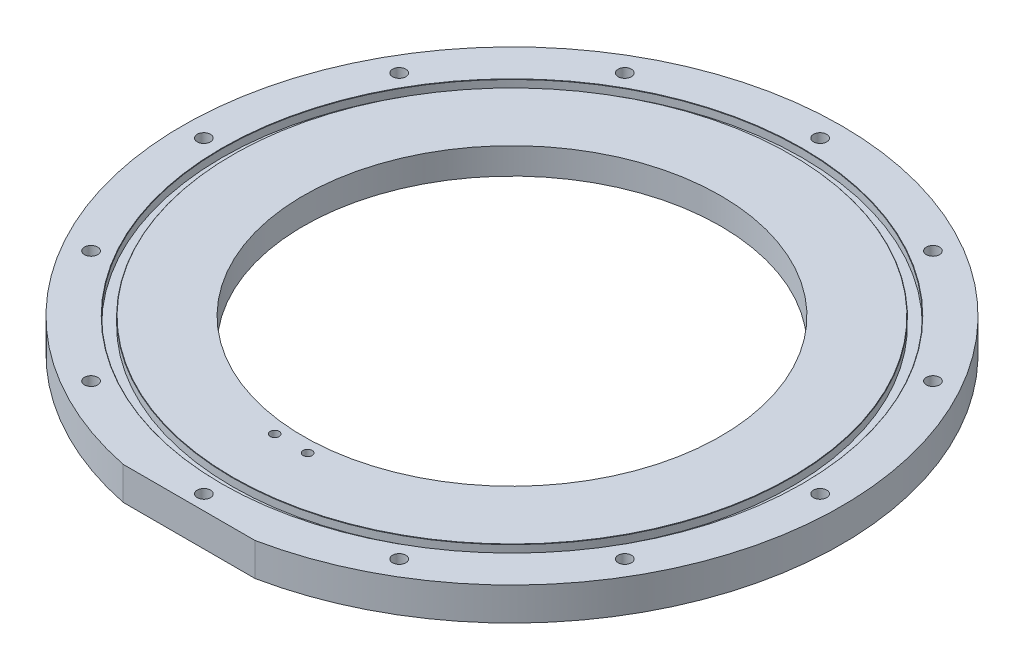
ISO-10303-21;
HEADER;
FILE_DESCRIPTION(('STEP AP214'),'2;1');
FILE_NAME('part.step','',(''),(''),'','','');
FILE_SCHEMA(('AUTOMOTIVE_DESIGN { 1 0 10303 214 1 1 1 1 }'));
ENDSEC;
DATA;
#1=APPLICATION_CONTEXT('core data for automotive mechanical design processes');
#2=APPLICATION_PROTOCOL_DEFINITION('international standard','automotive_design',2000,#1);
#3=PRODUCT_CONTEXT('',#1,'mechanical');
#4=PRODUCT('Part','Part','',(#3));
#5=PRODUCT_RELATED_PRODUCT_CATEGORY('part','',(#4));
#6=PRODUCT_DEFINITION_FORMATION('','',#4);
#7=PRODUCT_DEFINITION_CONTEXT('part definition',#1,'design');
#8=PRODUCT_DEFINITION('design','',#6,#7);
#9=PRODUCT_DEFINITION_SHAPE('','',#8);
#10=(LENGTH_UNIT() NAMED_UNIT(*) SI_UNIT(.MILLI.,.METRE.));
#11=(NAMED_UNIT(*) PLANE_ANGLE_UNIT() SI_UNIT($,.RADIAN.));
#12=(NAMED_UNIT(*) SI_UNIT($,.STERADIAN.) SOLID_ANGLE_UNIT());
#13=UNCERTAINTY_MEASURE_WITH_UNIT(LENGTH_MEASURE(1.E-05),#10,'distance_accuracy_value','');
#14=(GEOMETRIC_REPRESENTATION_CONTEXT(3) GLOBAL_UNCERTAINTY_ASSIGNED_CONTEXT((#13)) GLOBAL_UNIT_ASSIGNED_CONTEXT((#10,
#11,#12)) REPRESENTATION_CONTEXT('',''));
#15=CARTESIAN_POINT('',(0.,0.,0.));
#16=DIRECTION('',(0.,0.,1.));
#17=DIRECTION('',(1.,0.,0.));
#18=AXIS2_PLACEMENT_3D('',#15,#16,#17);
#19=CARTESIAN_POINT('',(105.7783,12.7,0.));
#20=DIRECTION('',(0.,1.,0.));
#21=DIRECTION('',(0.,0.,1.));
#22=AXIS2_PLACEMENT_3D('',#19,#20,#21);
#23=PLANE('',#22);
#24=CARTESIAN_POINT('',(-6.35,12.7,85.09));
#25=DIRECTION('',(0.,1.,0.));
#26=DIRECTION('',(0.,0.,1.));
#27=AXIS2_PLACEMENT_3D('',#24,#25,#26);
#28=CIRCLE('',#27,1.7272);
#29=CARTESIAN_POINT('',(-6.35,12.7,86.8172));
#30=VERTEX_POINT('',#29);
#31=EDGE_CURVE('E499',#30,#30,#28,.T.);
#32=ORIENTED_EDGE('',*,*,#31,.F.);
#33=EDGE_LOOP('',(#32));
#34=FACE_BOUND('',#33,.T.);
#35=CARTESIAN_POINT('',(6.35,12.7,85.09));
#36=DIRECTION('',(0.,1.,0.));
#37=DIRECTION('',(0.,0.,1.));
#38=AXIS2_PLACEMENT_3D('',#35,#36,#37);
#39=CIRCLE('',#38,1.7272);
#40=CARTESIAN_POINT('',(6.35,12.7,86.8172));
#41=VERTEX_POINT('',#40);
#42=EDGE_CURVE('E493',#41,#41,#39,.T.);
#43=ORIENTED_EDGE('',*,*,#42,.F.);
#44=EDGE_LOOP('',(#43));
#45=FACE_BOUND('',#44,.T.);
#46=CARTESIAN_POINT('',(0.,12.7,0.));
#47=DIRECTION('',(0.,1.,0.));
#48=DIRECTION('',(0.,0.,1.));
#49=AXIS2_PLACEMENT_3D('',#46,#47,#48);
#50=CIRCLE('',#49,107.6198);
#51=CARTESIAN_POINT('',(0.,12.7,107.6198));
#52=VERTEX_POINT('',#51);
#53=EDGE_CURVE('E86',#52,#52,#50,.T.);
#54=ORIENTED_EDGE('',*,*,#53,.T.);
#55=EDGE_LOOP('',(#54));
#56=FACE_BOUND('',#55,.T.);
#57=CARTESIAN_POINT('',(0.,12.7,0.));
#58=DIRECTION('',(0.,-1.,0.));
#59=DIRECTION('',(0.,0.,-1.));
#60=AXIS2_PLACEMENT_3D('',#57,#58,#59);
#61=CIRCLE('',#60,80.3783);
#62=CARTESIAN_POINT('',(0.,12.7,-80.3783));
#63=VERTEX_POINT('',#62);
#64=EDGE_CURVE('E84',#63,#63,#61,.T.);
#65=ORIENTED_EDGE('',*,*,#64,.T.);
#66=EDGE_LOOP('',(#65));
#67=FACE_BOUND('',#66,.T.);
#68=ADVANCED_FACE('F41',(#34,#45,#56,#67),#23,.T.);
#69=CARTESIAN_POINT('',(109.7915,0.,0.));
#70=DIRECTION('',(0.,-1.,0.));
#71=DIRECTION('',(0.,0.,-1.));
#72=AXIS2_PLACEMENT_3D('',#69,#70,#71);
#73=PLANE('',#72);
#74=DIRECTION('',(-1.,0.,0.));
#75=VECTOR('',#74,1.);
#76=CARTESIAN_POINT('',(-25.4,0.,124.434078933385));
#77=LINE('',#76,#75);
#78=CARTESIAN_POINT('',(25.4,0.,124.434078933385));
#79=VERTEX_POINT('',#78);
#80=CARTESIAN_POINT('',(-25.4,0.,124.434078933385));
#81=VERTEX_POINT('',#80);
#82=EDGE_CURVE('E73',#79,#81,#77,.T.);
#83=ORIENTED_EDGE('',*,*,#82,.T.);
#84=CARTESIAN_POINT('',(0.,0.,0.));
#85=DIRECTION('',(0.,-1.,0.));
#86=DIRECTION('',(0.,0.,-1.));
#87=AXIS2_PLACEMENT_3D('',#84,#85,#86);
#88=CIRCLE('',#87,127.);
#89=EDGE_CURVE('E80',#81,#79,#88,.T.);
#90=ORIENTED_EDGE('',*,*,#89,.T.);
#91=EDGE_LOOP('',(#83,#90));
#92=FACE_BOUND('',#91,.T.);
#93=CARTESIAN_POINT('',(0.,0.,-118.745));
#94=DIRECTION('',(0.,-1.,0.));
#95=DIRECTION('',(0.,0.,-1.));
#96=AXIS2_PLACEMENT_3D('',#93,#94,#95);
#97=CIRCLE('',#96,2.5527);
#98=CARTESIAN_POINT('',(0.,0.,-121.2977));
#99=VERTEX_POINT('',#98);
#100=EDGE_CURVE('E481',#99,#99,#97,.T.);
#101=ORIENTED_EDGE('',*,*,#100,.F.);
#102=EDGE_LOOP('',(#101));
#103=FACE_BOUND('',#102,.T.);
#104=CARTESIAN_POINT('',(59.3725,0.,-102.836186572383));
#105=DIRECTION('',(0.,-1.,0.));
#106=DIRECTION('',(0.,0.,-1.));
#107=AXIS2_PLACEMENT_3D('',#104,#105,#106);
#108=CIRCLE('',#107,2.5527);
#109=CARTESIAN_POINT('',(59.3725,0.,-105.388886572383));
#110=VERTEX_POINT('',#109);
#111=EDGE_CURVE('E475',#110,#110,#108,.T.);
#112=ORIENTED_EDGE('',*,*,#111,.F.);
#113=EDGE_LOOP('',(#112));
#114=FACE_BOUND('',#113,.T.);
#115=CARTESIAN_POINT('',(102.836186572383,0.,-59.3725));
#116=DIRECTION('',(0.,-1.,0.));
#117=DIRECTION('',(0.,0.,-1.));
#118=AXIS2_PLACEMENT_3D('',#115,#116,#117);
#119=CIRCLE('',#118,2.5527);
#120=CARTESIAN_POINT('',(102.836186572383,0.,-61.9252));
#121=VERTEX_POINT('',#120);
#122=EDGE_CURVE('E469',#121,#121,#119,.T.);
#123=ORIENTED_EDGE('',*,*,#122,.F.);
#124=EDGE_LOOP('',(#123));
#125=FACE_BOUND('',#124,.T.);
#126=CARTESIAN_POINT('',(118.745,0.,0.));
#127=DIRECTION('',(0.,-1.,0.));
#128=DIRECTION('',(0.,0.,-1.));
#129=AXIS2_PLACEMENT_3D('',#126,#127,#128);
#130=CIRCLE('',#129,2.5527);
#131=CARTESIAN_POINT('',(118.745,0.,-2.55270000000001));
#132=VERTEX_POINT('',#131);
#133=EDGE_CURVE('E463',#132,#132,#130,.T.);
#134=ORIENTED_EDGE('',*,*,#133,.F.);
#135=EDGE_LOOP('',(#134));
#136=FACE_BOUND('',#135,.T.);
#137=CARTESIAN_POINT('',(102.836186572383,0.,59.3725));
#138=DIRECTION('',(0.,-1.,0.));
#139=DIRECTION('',(0.,0.,-1.));
#140=AXIS2_PLACEMENT_3D('',#137,#138,#139);
#141=CIRCLE('',#140,2.5527);
#142=CARTESIAN_POINT('',(102.836186572383,0.,56.8198));
#143=VERTEX_POINT('',#142);
#144=EDGE_CURVE('E457',#143,#143,#141,.T.);
#145=ORIENTED_EDGE('',*,*,#144,.F.);
#146=EDGE_LOOP('',(#145));
#147=FACE_BOUND('',#146,.T.);
#148=CARTESIAN_POINT('',(59.3725,0.,102.836186572383));
#149=DIRECTION('',(0.,-1.,0.));
#150=DIRECTION('',(0.,0.,-1.));
#151=AXIS2_PLACEMENT_3D('',#148,#149,#150);
#152=CIRCLE('',#151,2.5527);
#153=CARTESIAN_POINT('',(59.3725,0.,100.283486572383));
#154=VERTEX_POINT('',#153);
#155=EDGE_CURVE('E451',#154,#154,#152,.T.);
#156=ORIENTED_EDGE('',*,*,#155,.F.);
#157=EDGE_LOOP('',(#156));
#158=FACE_BOUND('',#157,.T.);
#159=CARTESIAN_POINT('',(0.,0.,118.745));
#160=DIRECTION('',(0.,-1.,0.));
#161=DIRECTION('',(0.,0.,-1.));
#162=AXIS2_PLACEMENT_3D('',#159,#160,#161);
#163=CIRCLE('',#162,2.5527);
#164=CARTESIAN_POINT('',(0.,0.,116.1923));
#165=VERTEX_POINT('',#164);
#166=EDGE_CURVE('E445',#165,#165,#163,.T.);
#167=ORIENTED_EDGE('',*,*,#166,.F.);
#168=EDGE_LOOP('',(#167));
#169=FACE_BOUND('',#168,.T.);
#170=CARTESIAN_POINT('',(-59.3725,0.,102.836186572383));
#171=DIRECTION('',(0.,-1.,0.));
#172=DIRECTION('',(0.,0.,-1.));
#173=AXIS2_PLACEMENT_3D('',#170,#171,#172);
#174=CIRCLE('',#173,2.5527);
#175=CARTESIAN_POINT('',(-59.3725,0.,100.283486572383));
#176=VERTEX_POINT('',#175);
#177=EDGE_CURVE('E439',#176,#176,#174,.T.);
#178=ORIENTED_EDGE('',*,*,#177,.F.);
#179=EDGE_LOOP('',(#178));
#180=FACE_BOUND('',#179,.T.);
#181=CARTESIAN_POINT('',(-102.836186572383,0.,59.3725));
#182=DIRECTION('',(0.,-1.,0.));
#183=DIRECTION('',(0.,0.,-1.));
#184=AXIS2_PLACEMENT_3D('',#181,#182,#183);
#185=CIRCLE('',#184,2.5527);
#186=CARTESIAN_POINT('',(-102.836186572383,0.,56.8198));
#187=VERTEX_POINT('',#186);
#188=EDGE_CURVE('E433',#187,#187,#185,.T.);
#189=ORIENTED_EDGE('',*,*,#188,.F.);
#190=EDGE_LOOP('',(#189));
#191=FACE_BOUND('',#190,.T.);
#192=CARTESIAN_POINT('',(-118.745,0.,0.));
#193=DIRECTION('',(0.,-1.,0.));
#194=DIRECTION('',(0.,0.,-1.));
#195=AXIS2_PLACEMENT_3D('',#192,#193,#194);
#196=CIRCLE('',#195,2.5527);
#197=CARTESIAN_POINT('',(-118.745,0.,-2.55269999999998));
#198=VERTEX_POINT('',#197);
#199=EDGE_CURVE('E427',#198,#198,#196,.T.);
#200=ORIENTED_EDGE('',*,*,#199,.F.);
#201=EDGE_LOOP('',(#200));
#202=FACE_BOUND('',#201,.T.);
#203=CARTESIAN_POINT('',(-102.836186572383,0.,-59.3724999999999));
#204=DIRECTION('',(0.,-1.,0.));
#205=DIRECTION('',(0.,0.,-1.));
#206=AXIS2_PLACEMENT_3D('',#203,#204,#205);
#207=CIRCLE('',#206,2.5527);
#208=CARTESIAN_POINT('',(-102.836186572383,0.,-61.9251999999999));
#209=VERTEX_POINT('',#208);
#210=EDGE_CURVE('E421',#209,#209,#207,.T.);
#211=ORIENTED_EDGE('',*,*,#210,.F.);
#212=EDGE_LOOP('',(#211));
#213=FACE_BOUND('',#212,.T.);
#214=CARTESIAN_POINT('',(-59.3725,0.,-102.836186572383));
#215=DIRECTION('',(0.,-1.,0.));
#216=DIRECTION('',(0.,0.,-1.));
#217=AXIS2_PLACEMENT_3D('',#214,#215,#216);
#218=CIRCLE('',#217,2.5527);
#219=CARTESIAN_POINT('',(-59.3725,0.,-105.388886572383));
#220=VERTEX_POINT('',#219);
#221=EDGE_CURVE('E413',#220,#220,#218,.T.);
#222=ORIENTED_EDGE('',*,*,#221,.F.);
#223=EDGE_LOOP('',(#222));
#224=FACE_BOUND('',#223,.T.);
#225=CARTESIAN_POINT('',(0.,0.,0.));
#226=DIRECTION('',(0.,-1.,0.));
#227=DIRECTION('',(0.,0.,-1.));
#228=AXIS2_PLACEMENT_3D('',#225,#226,#227);
#229=CIRCLE('',#228,109.7915);
#230=CARTESIAN_POINT('',(0.,0.,-109.7915));
#231=VERTEX_POINT('',#230);
#232=EDGE_CURVE('E406',#231,#231,#229,.T.);
#233=ORIENTED_EDGE('',*,*,#232,.F.);
#234=EDGE_LOOP('',(#233));
#235=FACE_BOUND('',#234,.T.);
#236=ADVANCED_FACE('F117',(#92,#103,#114,#125,#136,#147,#158,#169,#180,#191,#202,#213,#224,
#235),#73,.T.);
#237=CARTESIAN_POINT('',(0.,0.,0.));
#238=DIRECTION('',(0.,-1.,0.));
#239=DIRECTION('',(0.,0.,-1.));
#240=AXIS2_PLACEMENT_3D('',#237,#238,#239);
#241=CYLINDRICAL_SURFACE('',#240,127.);
#242=DIRECTION('',(0.,-1.,0.));
#243=VECTOR('',#242,1.);
#244=CARTESIAN_POINT('',(25.4,0.,124.434078933385));
#245=LINE('',#244,#243);
#246=CARTESIAN_POINT('',(25.4,12.7,124.434078933385));
#247=VERTEX_POINT('',#246);
#248=EDGE_CURVE('E57',#247,#79,#245,.T.);
#249=ORIENTED_EDGE('',*,*,#248,.T.);
#250=ORIENTED_EDGE('',*,*,#89,.F.);
#251=DIRECTION('',(0.,-1.,0.));
#252=VECTOR('',#251,1.);
#253=CARTESIAN_POINT('',(-25.4,0.,124.434078933385));
#254=LINE('',#253,#252);
#255=CARTESIAN_POINT('',(-25.4,12.7,124.434078933385));
#256=VERTEX_POINT('',#255);
#257=EDGE_CURVE('E62',#81,#256,#254,.F.);
#258=ORIENTED_EDGE('',*,*,#257,.T.);
#259=CARTESIAN_POINT('',(0.,12.7,0.));
#260=DIRECTION('',(0.,-1.,0.));
#261=DIRECTION('',(0.,0.,-1.));
#262=AXIS2_PLACEMENT_3D('',#259,#260,#261);
#263=CIRCLE('',#262,127.);
#264=EDGE_CURVE('E78',#256,#247,#263,.T.);
#265=ORIENTED_EDGE('',*,*,#264,.T.);
#266=EDGE_LOOP('',(#249,#250,#258,#265));
#267=FACE_BOUND('',#266,.T.);
#268=ADVANCED_FACE('F77',(#267),#241,.T.);
#269=DIRECTION('',(-1.,0.,0.));
#270=VECTOR('',#269,1.);
#271=CARTESIAN_POINT('',(-25.4,12.7,124.434078933385));
#272=LINE('',#271,#270);
#273=EDGE_CURVE('E67',#247,#256,#272,.T.);
#274=ORIENTED_EDGE('',*,*,#273,.F.);
#275=ORIENTED_EDGE('',*,*,#264,.F.);
#276=EDGE_LOOP('',(#274,#275));
#277=FACE_BOUND('',#276,.T.);
#278=CARTESIAN_POINT('',(0.,12.7,0.));
#279=DIRECTION('',(0.,1.,0.));
#280=DIRECTION('',(0.,0.,1.));
#281=AXIS2_PLACEMENT_3D('',#278,#279,#280);
#282=CIRCLE('',#281,111.9378);
#283=CARTESIAN_POINT('',(0.,12.7,111.9378));
#284=VERTEX_POINT('',#283);
#285=EDGE_CURVE('E11',#284,#284,#282,.F.);
#286=ORIENTED_EDGE('',*,*,#285,.T.);
#287=EDGE_LOOP('',(#286));
#288=FACE_BOUND('',#287,.T.);
#289=CARTESIAN_POINT('',(0.,12.7,-118.745));
#290=DIRECTION('',(0.,1.,0.));
#291=DIRECTION('',(0.,0.,1.));
#292=AXIS2_PLACEMENT_3D('',#289,#290,#291);
#293=CIRCLE('',#292,2.5527);
#294=CARTESIAN_POINT('',(0.,12.7,-116.1923));
#295=VERTEX_POINT('',#294);
#296=EDGE_CURVE('E484',#295,#295,#293,.T.);
#297=ORIENTED_EDGE('',*,*,#296,.F.);
#298=EDGE_LOOP('',(#297));
#299=FACE_BOUND('',#298,.T.);
#300=CARTESIAN_POINT('',(59.3725,12.7,-102.836186572383));
#301=DIRECTION('',(0.,1.,0.));
#302=DIRECTION('',(0.,0.,1.));
#303=AXIS2_PLACEMENT_3D('',#300,#301,#302);
#304=CIRCLE('',#303,2.5527);
#305=CARTESIAN_POINT('',(59.3725,12.7,-100.283486572383));
#306=VERTEX_POINT('',#305);
#307=EDGE_CURVE('E478',#306,#306,#304,.T.);
#308=ORIENTED_EDGE('',*,*,#307,.F.);
#309=EDGE_LOOP('',(#308));
#310=FACE_BOUND('',#309,.T.);
#311=CARTESIAN_POINT('',(102.836186572383,12.7,-59.3725));
#312=DIRECTION('',(0.,1.,0.));
#313=DIRECTION('',(0.,0.,1.));
#314=AXIS2_PLACEMENT_3D('',#311,#312,#313);
#315=CIRCLE('',#314,2.55270000000001);
#316=CARTESIAN_POINT('',(102.836186572383,12.7,-56.8198));
#317=VERTEX_POINT('',#316);
#318=EDGE_CURVE('E472',#317,#317,#315,.T.);
#319=ORIENTED_EDGE('',*,*,#318,.F.);
#320=EDGE_LOOP('',(#319));
#321=FACE_BOUND('',#320,.T.);
#322=CARTESIAN_POINT('',(118.745,12.7,0.));
#323=DIRECTION('',(0.,1.,0.));
#324=DIRECTION('',(0.,0.,1.));
#325=AXIS2_PLACEMENT_3D('',#322,#323,#324);
#326=CIRCLE('',#325,2.55270000000001);
#327=CARTESIAN_POINT('',(118.745,12.7,2.5527));
#328=VERTEX_POINT('',#327);
#329=EDGE_CURVE('E466',#328,#328,#326,.T.);
#330=ORIENTED_EDGE('',*,*,#329,.F.);
#331=EDGE_LOOP('',(#330));
#332=FACE_BOUND('',#331,.T.);
#333=CARTESIAN_POINT('',(102.836186572383,12.7,59.3725));
#334=DIRECTION('',(0.,1.,0.));
#335=DIRECTION('',(0.,0.,1.));
#336=AXIS2_PLACEMENT_3D('',#333,#334,#335);
#337=CIRCLE('',#336,2.55270000000001);
#338=CARTESIAN_POINT('',(102.836186572383,12.7,61.9252));
#339=VERTEX_POINT('',#338);
#340=EDGE_CURVE('E460',#339,#339,#337,.T.);
#341=ORIENTED_EDGE('',*,*,#340,.F.);
#342=EDGE_LOOP('',(#341));
#343=FACE_BOUND('',#342,.T.);
#344=CARTESIAN_POINT('',(59.3725,12.7,102.836186572383));
#345=DIRECTION('',(0.,1.,0.));
#346=DIRECTION('',(0.,0.,1.));
#347=AXIS2_PLACEMENT_3D('',#344,#345,#346);
#348=CIRCLE('',#347,2.5527);
#349=CARTESIAN_POINT('',(59.3725,12.7,105.388886572383));
#350=VERTEX_POINT('',#349);
#351=EDGE_CURVE('E454',#350,#350,#348,.T.);
#352=ORIENTED_EDGE('',*,*,#351,.F.);
#353=EDGE_LOOP('',(#352));
#354=FACE_BOUND('',#353,.T.);
#355=CARTESIAN_POINT('',(0.,12.7,118.745));
#356=DIRECTION('',(0.,1.,0.));
#357=DIRECTION('',(0.,0.,1.));
#358=AXIS2_PLACEMENT_3D('',#355,#356,#357);
#359=CIRCLE('',#358,2.5527);
#360=CARTESIAN_POINT('',(0.,12.7,121.2977));
#361=VERTEX_POINT('',#360);
#362=EDGE_CURVE('E448',#361,#361,#359,.T.);
#363=ORIENTED_EDGE('',*,*,#362,.F.);
#364=EDGE_LOOP('',(#363));
#365=FACE_BOUND('',#364,.T.);
#366=CARTESIAN_POINT('',(-59.3725,12.7,102.836186572383));
#367=DIRECTION('',(0.,1.,0.));
#368=DIRECTION('',(0.,0.,1.));
#369=AXIS2_PLACEMENT_3D('',#366,#367,#368);
#370=CIRCLE('',#369,2.5527);
#371=CARTESIAN_POINT('',(-59.3725,12.7,105.388886572383));
#372=VERTEX_POINT('',#371);
#373=EDGE_CURVE('E442',#372,#372,#370,.T.);
#374=ORIENTED_EDGE('',*,*,#373,.F.);
#375=EDGE_LOOP('',(#374));
#376=FACE_BOUND('',#375,.T.);
#377=CARTESIAN_POINT('',(-102.836186572383,12.7,59.3725));
#378=DIRECTION('',(0.,1.,0.));
#379=DIRECTION('',(0.,0.,1.));
#380=AXIS2_PLACEMENT_3D('',#377,#378,#379);
#381=CIRCLE('',#380,2.55270000000001);
#382=CARTESIAN_POINT('',(-102.836186572383,12.7,61.9252));
#383=VERTEX_POINT('',#382);
#384=EDGE_CURVE('E436',#383,#383,#381,.T.);
#385=ORIENTED_EDGE('',*,*,#384,.F.);
#386=EDGE_LOOP('',(#385));
#387=FACE_BOUND('',#386,.T.);
#388=CARTESIAN_POINT('',(-118.745,12.7,0.));
#389=DIRECTION('',(0.,1.,0.));
#390=DIRECTION('',(0.,0.,1.));
#391=AXIS2_PLACEMENT_3D('',#388,#389,#390);
#392=CIRCLE('',#391,2.55270000000001);
#393=CARTESIAN_POINT('',(-118.745,12.7,2.55270000000003));
#394=VERTEX_POINT('',#393);
#395=EDGE_CURVE('E430',#394,#394,#392,.T.);
#396=ORIENTED_EDGE('',*,*,#395,.F.);
#397=EDGE_LOOP('',(#396));
#398=FACE_BOUND('',#397,.T.);
#399=CARTESIAN_POINT('',(-102.836186572383,12.7,-59.3724999999999));
#400=DIRECTION('',(0.,1.,0.));
#401=DIRECTION('',(0.,0.,1.));
#402=AXIS2_PLACEMENT_3D('',#399,#400,#401);
#403=CIRCLE('',#402,2.55270000000001);
#404=CARTESIAN_POINT('',(-102.836186572383,12.7,-56.8197999999999));
#405=VERTEX_POINT('',#404);
#406=EDGE_CURVE('E424',#405,#405,#403,.T.);
#407=ORIENTED_EDGE('',*,*,#406,.F.);
#408=EDGE_LOOP('',(#407));
#409=FACE_BOUND('',#408,.T.);
#410=CARTESIAN_POINT('',(-59.3725,12.7,-102.836186572383));
#411=DIRECTION('',(0.,1.,0.));
#412=DIRECTION('',(0.,0.,1.));
#413=AXIS2_PLACEMENT_3D('',#410,#411,#412);
#414=CIRCLE('',#413,2.5527);
#415=CARTESIAN_POINT('',(-59.3725,12.7,-100.283486572383));
#416=VERTEX_POINT('',#415);
#417=EDGE_CURVE('E418',#416,#416,#414,.T.);
#418=ORIENTED_EDGE('',*,*,#417,.F.);
#419=EDGE_LOOP('',(#418));
#420=FACE_BOUND('',#419,.T.);
#421=ADVANCED_FACE('F82',(#277,#288,#299,#310,#321,#332,#343,#354,#365,#376,#387,#398,#409,
#420),#23,.T.);
#422=CARTESIAN_POINT('',(0.,0.,0.));
#423=DIRECTION('',(0.,-1.,0.));
#424=DIRECTION('',(0.,0.,-1.));
#425=AXIS2_PLACEMENT_3D('',#422,#423,#424);
#426=CYLINDRICAL_SURFACE('',#425,80.3783);
#427=CARTESIAN_POINT('',(0.,2.54,0.));
#428=DIRECTION('',(0.,-1.,0.));
#429=DIRECTION('',(0.,0.,-1.));
#430=AXIS2_PLACEMENT_3D('',#427,#428,#429);
#431=CIRCLE('',#430,80.3783);
#432=CARTESIAN_POINT('',(0.,2.54,-80.3783));
#433=VERTEX_POINT('',#432);
#434=EDGE_CURVE('E89',#433,#433,#431,.T.);
#435=ORIENTED_EDGE('',*,*,#434,.T.);
#436=EDGE_LOOP('',(#435));
#437=FACE_BOUND('',#436,.T.);
#438=ORIENTED_EDGE('',*,*,#64,.F.);
#439=EDGE_LOOP('',(#438));
#440=FACE_BOUND('',#439,.T.);
#441=ADVANCED_FACE('F130',(#437,#440),#426,.F.);
#442=CARTESIAN_POINT('',(109.7915,2.54,0.));
#443=DIRECTION('',(0.,-1.,0.));
#444=DIRECTION('',(0.,0.,-1.));
#445=AXIS2_PLACEMENT_3D('',#442,#443,#444);
#446=PLANE('',#445);
#447=CARTESIAN_POINT('',(-6.35,2.54,85.09));
#448=DIRECTION('',(0.,-1.,0.));
#449=DIRECTION('',(0.,0.,-1.));
#450=AXIS2_PLACEMENT_3D('',#447,#448,#449);
#451=CIRCLE('',#450,1.7272);
#452=CARTESIAN_POINT('',(-6.35,2.54,83.3628));
#453=VERTEX_POINT('',#452);
#454=EDGE_CURVE('E72',#453,#453,#451,.T.);
#455=ORIENTED_EDGE('',*,*,#454,.F.);
#456=EDGE_LOOP('',(#455));
#457=FACE_BOUND('',#456,.T.);
#458=CARTESIAN_POINT('',(6.35,2.54,85.09));
#459=DIRECTION('',(0.,-1.,0.));
#460=DIRECTION('',(0.,0.,-1.));
#461=AXIS2_PLACEMENT_3D('',#458,#459,#460);
#462=CIRCLE('',#461,1.7272);
#463=CARTESIAN_POINT('',(6.35,2.54,83.3628));
#464=VERTEX_POINT('',#463);
#465=EDGE_CURVE('E496',#464,#464,#462,.T.);
#466=ORIENTED_EDGE('',*,*,#465,.F.);
#467=EDGE_LOOP('',(#466));
#468=FACE_BOUND('',#467,.T.);
#469=CARTESIAN_POINT('',(0.,2.54,0.));
#470=DIRECTION('',(0.,-1.,0.));
#471=DIRECTION('',(0.,0.,-1.));
#472=AXIS2_PLACEMENT_3D('',#469,#470,#471);
#473=CIRCLE('',#472,109.7915);
#474=CARTESIAN_POINT('',(0.,2.54,-109.7915));
#475=VERTEX_POINT('',#474);
#476=EDGE_CURVE('E409',#475,#475,#473,.T.);
#477=ORIENTED_EDGE('',*,*,#476,.T.);
#478=EDGE_LOOP('',(#477));
#479=FACE_BOUND('',#478,.T.);
#480=ORIENTED_EDGE('',*,*,#434,.F.);
#481=EDGE_LOOP('',(#480));
#482=FACE_BOUND('',#481,.T.);
#483=ADVANCED_FACE('F135',(#457,#468,#479,#482),#446,.T.);
#484=CARTESIAN_POINT('',(0.,0.,0.));
#485=DIRECTION('',(0.,-1.,0.));
#486=DIRECTION('',(0.,0.,-1.));
#487=AXIS2_PLACEMENT_3D('',#484,#485,#486);
#488=CYLINDRICAL_SURFACE('',#487,109.7915);
#489=ORIENTED_EDGE('',*,*,#232,.T.);
#490=EDGE_LOOP('',(#489));
#491=FACE_BOUND('',#490,.T.);
#492=ORIENTED_EDGE('',*,*,#476,.F.);
#493=EDGE_LOOP('',(#492));
#494=FACE_BOUND('',#493,.T.);
#495=ADVANCED_FACE('F176',(#491,#494),#488,.F.);
#496=CARTESIAN_POINT('',(-59.3725,12.7,-102.836186572383));
#497=DIRECTION('',(0.,1.,0.));
#498=DIRECTION('',(0.,0.,1.));
#499=AXIS2_PLACEMENT_3D('',#496,#497,#498);
#500=CYLINDRICAL_SURFACE('',#499,2.5527);
#501=ORIENTED_EDGE('',*,*,#417,.T.);
#502=EDGE_LOOP('',(#501));
#503=FACE_BOUND('',#502,.T.);
#504=ORIENTED_EDGE('',*,*,#221,.T.);
#505=EDGE_LOOP('',(#504));
#506=FACE_BOUND('',#505,.T.);
#507=ADVANCED_FACE('F344',(#503,#506),#500,.F.);
#508=CARTESIAN_POINT('',(-102.836186572383,12.7,-59.3724999999999));
#509=DIRECTION('',(0.,1.,0.));
#510=DIRECTION('',(0.,0.,1.));
#511=AXIS2_PLACEMENT_3D('',#508,#509,#510);
#512=CYLINDRICAL_SURFACE('',#511,2.5527);
#513=ORIENTED_EDGE('',*,*,#406,.T.);
#514=EDGE_LOOP('',(#513));
#515=FACE_BOUND('',#514,.T.);
#516=ORIENTED_EDGE('',*,*,#210,.T.);
#517=EDGE_LOOP('',(#516));
#518=FACE_BOUND('',#517,.T.);
#519=ADVANCED_FACE('F333',(#515,#518),#512,.F.);
#520=CARTESIAN_POINT('',(-118.745,12.7,0.));
#521=DIRECTION('',(0.,1.,0.));
#522=DIRECTION('',(0.,0.,1.));
#523=AXIS2_PLACEMENT_3D('',#520,#521,#522);
#524=CYLINDRICAL_SURFACE('',#523,2.5527);
#525=ORIENTED_EDGE('',*,*,#395,.T.);
#526=EDGE_LOOP('',(#525));
#527=FACE_BOUND('',#526,.T.);
#528=ORIENTED_EDGE('',*,*,#199,.T.);
#529=EDGE_LOOP('',(#528));
#530=FACE_BOUND('',#529,.T.);
#531=ADVANCED_FACE('F322',(#527,#530),#524,.F.);
#532=CARTESIAN_POINT('',(-102.836186572383,12.7,59.3725));
#533=DIRECTION('',(0.,1.,0.));
#534=DIRECTION('',(0.,0.,1.));
#535=AXIS2_PLACEMENT_3D('',#532,#533,#534);
#536=CYLINDRICAL_SURFACE('',#535,2.5527);
#537=ORIENTED_EDGE('',*,*,#384,.T.);
#538=EDGE_LOOP('',(#537));
#539=FACE_BOUND('',#538,.T.);
#540=ORIENTED_EDGE('',*,*,#188,.T.);
#541=EDGE_LOOP('',(#540));
#542=FACE_BOUND('',#541,.T.);
#543=ADVANCED_FACE('F312',(#539,#542),#536,.F.);
#544=CARTESIAN_POINT('',(-59.3725,12.7,102.836186572383));
#545=DIRECTION('',(0.,1.,0.));
#546=DIRECTION('',(0.,0.,1.));
#547=AXIS2_PLACEMENT_3D('',#544,#545,#546);
#548=CYLINDRICAL_SURFACE('',#547,2.5527);
#549=ORIENTED_EDGE('',*,*,#373,.T.);
#550=EDGE_LOOP('',(#549));
#551=FACE_BOUND('',#550,.T.);
#552=ORIENTED_EDGE('',*,*,#177,.T.);
#553=EDGE_LOOP('',(#552));
#554=FACE_BOUND('',#553,.T.);
#555=ADVANCED_FACE('F301',(#551,#554),#548,.F.);
#556=CARTESIAN_POINT('',(0.,12.7,118.745));
#557=DIRECTION('',(0.,1.,0.));
#558=DIRECTION('',(0.,0.,1.));
#559=AXIS2_PLACEMENT_3D('',#556,#557,#558);
#560=CYLINDRICAL_SURFACE('',#559,2.5527);
#561=ORIENTED_EDGE('',*,*,#362,.T.);
#562=EDGE_LOOP('',(#561));
#563=FACE_BOUND('',#562,.T.);
#564=ORIENTED_EDGE('',*,*,#166,.T.);
#565=EDGE_LOOP('',(#564));
#566=FACE_BOUND('',#565,.T.);
#567=ADVANCED_FACE('F290',(#563,#566),#560,.F.);
#568=CARTESIAN_POINT('',(59.3725,12.7,102.836186572383));
#569=DIRECTION('',(0.,1.,0.));
#570=DIRECTION('',(0.,0.,1.));
#571=AXIS2_PLACEMENT_3D('',#568,#569,#570);
#572=CYLINDRICAL_SURFACE('',#571,2.5527);
#573=ORIENTED_EDGE('',*,*,#351,.T.);
#574=EDGE_LOOP('',(#573));
#575=FACE_BOUND('',#574,.T.);
#576=ORIENTED_EDGE('',*,*,#155,.T.);
#577=EDGE_LOOP('',(#576));
#578=FACE_BOUND('',#577,.T.);
#579=ADVANCED_FACE('F279',(#575,#578),#572,.F.);
#580=CARTESIAN_POINT('',(102.836186572383,12.7,59.3725));
#581=DIRECTION('',(0.,1.,0.));
#582=DIRECTION('',(0.,0.,1.));
#583=AXIS2_PLACEMENT_3D('',#580,#581,#582);
#584=CYLINDRICAL_SURFACE('',#583,2.5527);
#585=ORIENTED_EDGE('',*,*,#340,.T.);
#586=EDGE_LOOP('',(#585));
#587=FACE_BOUND('',#586,.T.);
#588=ORIENTED_EDGE('',*,*,#144,.T.);
#589=EDGE_LOOP('',(#588));
#590=FACE_BOUND('',#589,.T.);
#591=ADVANCED_FACE('F268',(#587,#590),#584,.F.);
#592=CARTESIAN_POINT('',(118.745,12.7,0.));
#593=DIRECTION('',(0.,1.,0.));
#594=DIRECTION('',(0.,0.,1.));
#595=AXIS2_PLACEMENT_3D('',#592,#593,#594);
#596=CYLINDRICAL_SURFACE('',#595,2.5527);
#597=ORIENTED_EDGE('',*,*,#329,.T.);
#598=EDGE_LOOP('',(#597));
#599=FACE_BOUND('',#598,.T.);
#600=ORIENTED_EDGE('',*,*,#133,.T.);
#601=EDGE_LOOP('',(#600));
#602=FACE_BOUND('',#601,.T.);
#603=ADVANCED_FACE('F257',(#599,#602),#596,.F.);
#604=CARTESIAN_POINT('',(102.836186572383,12.7,-59.3725));
#605=DIRECTION('',(0.,1.,0.));
#606=DIRECTION('',(0.,0.,1.));
#607=AXIS2_PLACEMENT_3D('',#604,#605,#606);
#608=CYLINDRICAL_SURFACE('',#607,2.5527);
#609=ORIENTED_EDGE('',*,*,#318,.T.);
#610=EDGE_LOOP('',(#609));
#611=FACE_BOUND('',#610,.T.);
#612=ORIENTED_EDGE('',*,*,#122,.T.);
#613=EDGE_LOOP('',(#612));
#614=FACE_BOUND('',#613,.T.);
#615=ADVANCED_FACE('F246',(#611,#614),#608,.F.);
#616=CARTESIAN_POINT('',(59.3725,12.7,-102.836186572383));
#617=DIRECTION('',(0.,1.,0.));
#618=DIRECTION('',(0.,0.,1.));
#619=AXIS2_PLACEMENT_3D('',#616,#617,#618);
#620=CYLINDRICAL_SURFACE('',#619,2.5527);
#621=ORIENTED_EDGE('',*,*,#307,.T.);
#622=EDGE_LOOP('',(#621));
#623=FACE_BOUND('',#622,.T.);
#624=ORIENTED_EDGE('',*,*,#111,.T.);
#625=EDGE_LOOP('',(#624));
#626=FACE_BOUND('',#625,.T.);
#627=ADVANCED_FACE('F234',(#623,#626),#620,.F.);
#628=CARTESIAN_POINT('',(0.,12.7,-118.745));
#629=DIRECTION('',(0.,1.,0.));
#630=DIRECTION('',(0.,0.,1.));
#631=AXIS2_PLACEMENT_3D('',#628,#629,#630);
#632=CYLINDRICAL_SURFACE('',#631,2.5527);
#633=ORIENTED_EDGE('',*,*,#296,.T.);
#634=EDGE_LOOP('',(#633));
#635=FACE_BOUND('',#634,.T.);
#636=ORIENTED_EDGE('',*,*,#100,.T.);
#637=EDGE_LOOP('',(#636));
#638=FACE_BOUND('',#637,.T.);
#639=ADVANCED_FACE('F216',(#635,#638),#632,.F.);
#640=CARTESIAN_POINT('',(0.,12.7,0.));
#641=DIRECTION('',(0.,1.,0.));
#642=DIRECTION('',(0.,0.,1.));
#643=AXIS2_PLACEMENT_3D('',#640,#641,#642);
#644=CYLINDRICAL_SURFACE('',#643,107.7468);
#645=CARTESIAN_POINT('',(0.,12.5730000000001,0.));
#646=DIRECTION('',(0.,1.,0.));
#647=DIRECTION('',(0.,0.,1.));
#648=AXIS2_PLACEMENT_3D('',#645,#646,#647);
#649=CIRCLE('',#648,107.7468);
#650=CARTESIAN_POINT('',(0.,12.5730000000001,107.7468));
#651=VERTEX_POINT('',#650);
#652=EDGE_CURVE('E95',#651,#651,#649,.F.);
#653=ORIENTED_EDGE('',*,*,#652,.T.);
#654=EDGE_LOOP('',(#653));
#655=FACE_BOUND('',#654,.T.);
#656=CARTESIAN_POINT('',(0.,9.6266,0.));
#657=DIRECTION('',(0.,1.,0.));
#658=DIRECTION('',(0.,0.,1.));
#659=AXIS2_PLACEMENT_3D('',#656,#657,#658);
#660=CIRCLE('',#659,107.7468);
#661=CARTESIAN_POINT('',(0.,9.6266,107.7468));
#662=VERTEX_POINT('',#661);
#663=EDGE_CURVE('E487',#662,#662,#660,.T.);
#664=ORIENTED_EDGE('',*,*,#663,.T.);
#665=EDGE_LOOP('',(#664));
#666=FACE_BOUND('',#665,.T.);
#667=ADVANCED_FACE('F212',(#655,#666),#644,.T.);
#668=CARTESIAN_POINT('',(107.7468,9.6266,0.));
#669=DIRECTION('',(0.,1.,0.));
#670=DIRECTION('',(0.,0.,1.));
#671=AXIS2_PLACEMENT_3D('',#668,#669,#670);
#672=PLANE('',#671);
#673=CARTESIAN_POINT('',(0.,9.6266,0.));
#674=DIRECTION('',(0.,1.,0.));
#675=DIRECTION('',(0.,0.,1.));
#676=AXIS2_PLACEMENT_3D('',#673,#674,#675);
#677=CIRCLE('',#676,111.8108);
#678=CARTESIAN_POINT('',(0.,9.6266,111.8108));
#679=VERTEX_POINT('',#678);
#680=EDGE_CURVE('E490',#679,#679,#677,.T.);
#681=ORIENTED_EDGE('',*,*,#680,.T.);
#682=EDGE_LOOP('',(#681));
#683=FACE_BOUND('',#682,.T.);
#684=ORIENTED_EDGE('',*,*,#663,.F.);
#685=EDGE_LOOP('',(#684));
#686=FACE_BOUND('',#685,.T.);
#687=ADVANCED_FACE('F205',(#683,#686),#672,.T.);
#688=CARTESIAN_POINT('',(0.,12.7,0.));
#689=DIRECTION('',(0.,1.,0.));
#690=DIRECTION('',(0.,0.,1.));
#691=AXIS2_PLACEMENT_3D('',#688,#689,#690);
#692=CYLINDRICAL_SURFACE('',#691,111.8108);
#693=CARTESIAN_POINT('',(0.,12.5730000000001,0.));
#694=DIRECTION('',(0.,1.,0.));
#695=DIRECTION('',(0.,0.,1.));
#696=AXIS2_PLACEMENT_3D('',#693,#694,#695);
#697=CIRCLE('',#696,111.8108);
#698=CARTESIAN_POINT('',(0.,12.5730000000001,111.8108));
#699=VERTEX_POINT('',#698);
#700=EDGE_CURVE('E50',#699,#699,#697,.T.);
#701=ORIENTED_EDGE('',*,*,#700,.T.);
#702=EDGE_LOOP('',(#701));
#703=FACE_BOUND('',#702,.T.);
#704=ORIENTED_EDGE('',*,*,#680,.F.);
#705=EDGE_LOOP('',(#704));
#706=FACE_BOUND('',#705,.T.);
#707=ADVANCED_FACE('F100',(#703,#706),#692,.F.);
#708=CARTESIAN_POINT('',(0.,12.7,0.));
#709=DIRECTION('',(0.,-1.,0.));
#710=DIRECTION('',(0.,0.,-1.));
#711=AXIS2_PLACEMENT_3D('',#708,#709,#710);
#712=CONICAL_SURFACE('',#711,107.6198,0.785398163397394);
#713=ORIENTED_EDGE('',*,*,#652,.F.);
#714=EDGE_LOOP('',(#713));
#715=FACE_BOUND('',#714,.T.);
#716=ORIENTED_EDGE('',*,*,#53,.F.);
#717=EDGE_LOOP('',(#716));
#718=FACE_BOUND('',#717,.T.);
#719=ADVANCED_FACE('F105',(#715,#718),#712,.T.);
#720=CARTESIAN_POINT('',(0.,12.5730000000001,0.));
#721=DIRECTION('',(0.,1.,0.));
#722=DIRECTION('',(0.,0.,1.));
#723=AXIS2_PLACEMENT_3D('',#720,#721,#722);
#724=CONICAL_SURFACE('',#723,111.8108,0.785398163397448);
#725=ORIENTED_EDGE('',*,*,#285,.F.);
#726=EDGE_LOOP('',(#725));
#727=FACE_BOUND('',#726,.T.);
#728=ORIENTED_EDGE('',*,*,#700,.F.);
#729=EDGE_LOOP('',(#728));
#730=FACE_BOUND('',#729,.T.);
#731=ADVANCED_FACE('F44',(#727,#730),#724,.F.);
#732=CARTESIAN_POINT('',(6.35,2.54,85.09));
#733=DIRECTION('',(0.,-1.,0.));
#734=DIRECTION('',(0.,0.,-1.));
#735=AXIS2_PLACEMENT_3D('',#732,#733,#734);
#736=CYLINDRICAL_SURFACE('',#735,1.7272);
#737=ORIENTED_EDGE('',*,*,#465,.T.);
#738=EDGE_LOOP('',(#737));
#739=FACE_BOUND('',#738,.T.);
#740=ORIENTED_EDGE('',*,*,#42,.T.);
#741=EDGE_LOOP('',(#740));
#742=FACE_BOUND('',#741,.T.);
#743=ADVANCED_FACE('F104',(#739,#742),#736,.F.);
#744=CARTESIAN_POINT('',(-6.35,2.54,85.09));
#745=DIRECTION('',(0.,-1.,0.));
#746=DIRECTION('',(0.,0.,-1.));
#747=AXIS2_PLACEMENT_3D('',#744,#745,#746);
#748=CYLINDRICAL_SURFACE('',#747,1.7272);
#749=ORIENTED_EDGE('',*,*,#454,.T.);
#750=EDGE_LOOP('',(#749));
#751=FACE_BOUND('',#750,.T.);
#752=ORIENTED_EDGE('',*,*,#31,.T.);
#753=EDGE_LOOP('',(#752));
#754=FACE_BOUND('',#753,.T.);
#755=ADVANCED_FACE('F111',(#751,#754),#748,.F.);
#756=CARTESIAN_POINT('',(-25.4,-0.000999999999999265,124.434078933385));
#757=DIRECTION('',(0.,0.,-1.));
#758=DIRECTION('',(-1.,0.,0.));
#759=AXIS2_PLACEMENT_3D('',#756,#757,#758);
#760=PLANE('',#759);
#761=ORIENTED_EDGE('',*,*,#248,.F.);
#762=ORIENTED_EDGE('',*,*,#273,.T.);
#763=ORIENTED_EDGE('',*,*,#257,.F.);
#764=ORIENTED_EDGE('',*,*,#82,.F.);
#765=EDGE_LOOP('',(#761,#762,#763,#764));
#766=FACE_BOUND('',#765,.T.);
#767=ADVANCED_FACE('F68',(#766),#760,.F.);
#768=CLOSED_SHELL('',(#68,#236,#268,#421,#441,#483,#495,#507,#519,#531,#543,#555,#567,#579,#591,
#603,#615,#627,#639,#667,#687,#707,#719,#731,#743,#755,#767));
#769=MANIFOLD_SOLID_BREP('B2',#768);
#770=ADVANCED_BREP_SHAPE_REPRESENTATION('',(#18,#769),#14);
#771=SHAPE_DEFINITION_REPRESENTATION(#9,#770);
ENDSEC;
END-ISO-10303-21;
